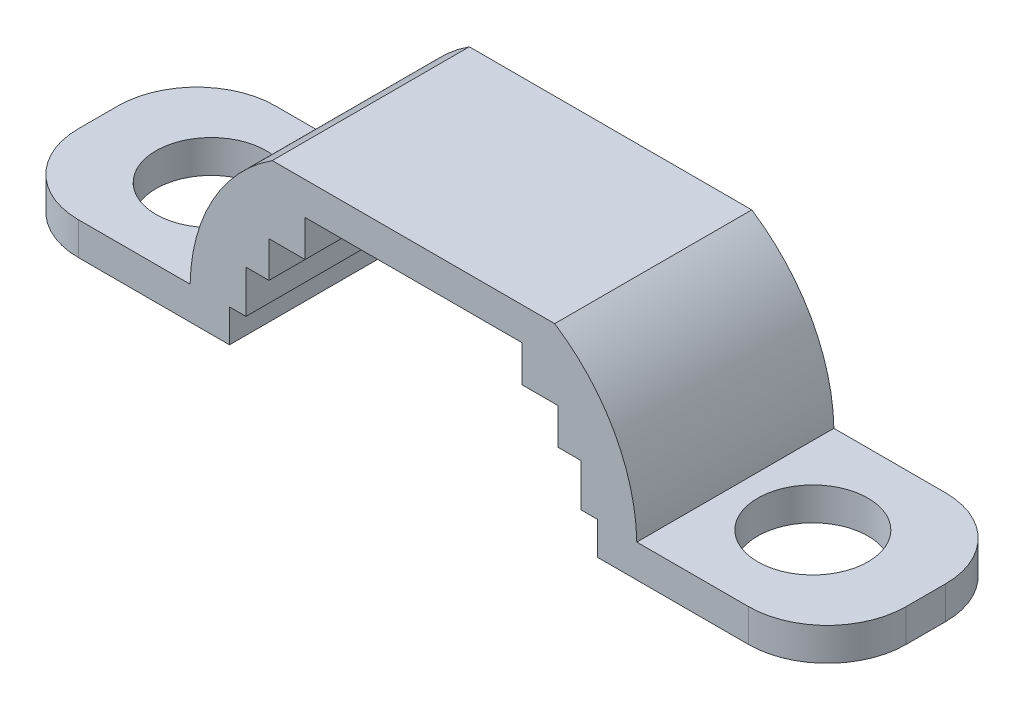
ISO-10303-21;
HEADER;
FILE_DESCRIPTION(('STEP AP214'),'2;1');
FILE_NAME('part.step','',(''),(''),'','','');
FILE_SCHEMA(('AUTOMOTIVE_DESIGN { 1 0 10303 214 1 1 1 1 }'));
ENDSEC;
DATA;
#1=APPLICATION_CONTEXT('core data for automotive mechanical design processes');
#2=APPLICATION_PROTOCOL_DEFINITION('international standard','automotive_design',2000,#1);
#3=PRODUCT_CONTEXT('',#1,'mechanical');
#4=PRODUCT('Part','Part','',(#3));
#5=PRODUCT_RELATED_PRODUCT_CATEGORY('part','',(#4));
#6=PRODUCT_DEFINITION_FORMATION('','',#4);
#7=PRODUCT_DEFINITION_CONTEXT('part definition',#1,'design');
#8=PRODUCT_DEFINITION('design','',#6,#7);
#9=PRODUCT_DEFINITION_SHAPE('','',#8);
#10=(LENGTH_UNIT() NAMED_UNIT(*) SI_UNIT(.MILLI.,.METRE.));
#11=(NAMED_UNIT(*) PLANE_ANGLE_UNIT() SI_UNIT($,.RADIAN.));
#12=(NAMED_UNIT(*) SI_UNIT($,.STERADIAN.) SOLID_ANGLE_UNIT());
#13=UNCERTAINTY_MEASURE_WITH_UNIT(LENGTH_MEASURE(1.E-05),#10,'distance_accuracy_value','');
#14=(GEOMETRIC_REPRESENTATION_CONTEXT(3) GLOBAL_UNCERTAINTY_ASSIGNED_CONTEXT((#13)) GLOBAL_UNIT_ASSIGNED_CONTEXT((#10,
#11,#12)) REPRESENTATION_CONTEXT('',''));
#15=CARTESIAN_POINT('',(0.,0.,0.));
#16=DIRECTION('',(0.,0.,1.));
#17=DIRECTION('',(1.,0.,0.));
#18=AXIS2_PLACEMENT_3D('',#15,#16,#17);
#19=CARTESIAN_POINT('',(-63.,9.5,15.));
#20=DIRECTION('',(0.,1.,0.));
#21=DIRECTION('',(0.,0.,1.));
#22=AXIS2_PLACEMENT_3D('',#19,#20,#21);
#23=PLANE('',#22);
#24=CARTESIAN_POINT('',(-45.8,9.5,0.));
#25=DIRECTION('',(0.,1.,0.));
#26=DIRECTION('',(0.,0.,1.));
#27=AXIS2_PLACEMENT_3D('',#24,#25,#26);
#28=CIRCLE('',#27,8.4);
#29=CARTESIAN_POINT('',(-45.8,9.5,8.4));
#30=VERTEX_POINT('',#29);
#31=EDGE_CURVE('E436',#30,#30,#28,.T.);
#32=ORIENTED_EDGE('',*,*,#31,.F.);
#33=EDGE_LOOP('',(#32));
#34=FACE_BOUND('',#33,.T.);
#35=DIRECTION('',(1.,0.,0.));
#36=VECTOR('',#35,1.);
#37=CARTESIAN_POINT('',(-63.,9.5,15.));
#38=LINE('',#37,#36);
#39=CARTESIAN_POINT('',(-51.,9.5,15.));
#40=VERTEX_POINT('',#39);
#41=CARTESIAN_POINT('',(-34.,9.50000000000001,15.));
#42=VERTEX_POINT('',#41);
#43=EDGE_CURVE('E448',#40,#42,#38,.T.);
#44=ORIENTED_EDGE('',*,*,#43,.T.);
#45=DIRECTION('',(0.,0.,-1.));
#46=VECTOR('',#45,1.);
#47=CARTESIAN_POINT('',(-34.,9.50000000000001,40.7827946506968));
#48=LINE('',#47,#46);
#49=CARTESIAN_POINT('',(-34.,9.50000000000001,-15.));
#50=VERTEX_POINT('',#49);
#51=EDGE_CURVE('E251',#42,#50,#48,.T.);
#52=ORIENTED_EDGE('',*,*,#51,.T.);
#53=DIRECTION('',(1.,0.,0.));
#54=VECTOR('',#53,1.);
#55=CARTESIAN_POINT('',(-63.,9.5,-15.));
#56=LINE('',#55,#54);
#57=CARTESIAN_POINT('',(-51.,9.5,-15.));
#58=VERTEX_POINT('',#57);
#59=EDGE_CURVE('E249',#58,#50,#56,.T.);
#60=ORIENTED_EDGE('',*,*,#59,.F.);
#61=CARTESIAN_POINT('',(-51.,9.5,-3.));
#62=DIRECTION('',(0.,1.,0.));
#63=DIRECTION('',(0.,0.,1.));
#64=AXIS2_PLACEMENT_3D('',#61,#62,#63);
#65=CIRCLE('',#64,12.);
#66=CARTESIAN_POINT('',(-63.,9.5,-3.));
#67=VERTEX_POINT('',#66);
#68=EDGE_CURVE('E335',#58,#67,#65,.T.);
#69=ORIENTED_EDGE('',*,*,#68,.T.);
#70=DIRECTION('',(0.,0.,-1.));
#71=VECTOR('',#70,1.);
#72=CARTESIAN_POINT('',(-63.,9.5,15.));
#73=LINE('',#72,#71);
#74=CARTESIAN_POINT('',(-63.,9.5,3.));
#75=VERTEX_POINT('',#74);
#76=EDGE_CURVE('E239',#75,#67,#73,.T.);
#77=ORIENTED_EDGE('',*,*,#76,.F.);
#78=CARTESIAN_POINT('',(-51.,9.5,3.));
#79=DIRECTION('',(0.,1.,0.));
#80=DIRECTION('',(0.,0.,1.));
#81=AXIS2_PLACEMENT_3D('',#78,#79,#80);
#82=CIRCLE('',#81,12.);
#83=EDGE_CURVE('E332',#75,#40,#82,.T.);
#84=ORIENTED_EDGE('',*,*,#83,.T.);
#85=EDGE_LOOP('',(#44,#52,#60,#69,#77,#84));
#86=FACE_BOUND('',#85,.T.);
#87=ADVANCED_FACE('F39',(#34,#86),#23,.T.);
#88=CARTESIAN_POINT('',(-16.5,27.05,15.));
#89=DIRECTION('',(0.,1.,0.));
#90=DIRECTION('',(0.,0.,1.));
#91=AXIS2_PLACEMENT_3D('',#88,#89,#90);
#92=PLANE('',#91);
#93=DIRECTION('',(1.,0.,0.));
#94=VECTOR('',#93,1.);
#95=CARTESIAN_POINT('',(-16.5,27.05,-15.));
#96=LINE('',#95,#94);
#97=CARTESIAN_POINT('',(-16.5,27.05,-15.));
#98=VERTEX_POINT('',#97);
#99=CARTESIAN_POINT('',(16.5,27.05,-15.));
#100=VERTEX_POINT('',#99);
#101=EDGE_CURVE('E256',#98,#100,#96,.T.);
#102=ORIENTED_EDGE('',*,*,#101,.T.);
#103=DIRECTION('',(0.,0.,-1.));
#104=VECTOR('',#103,1.);
#105=CARTESIAN_POINT('',(16.5,27.05,15.));
#106=LINE('',#105,#104);
#107=CARTESIAN_POINT('',(16.5,27.05,15.));
#108=VERTEX_POINT('',#107);
#109=EDGE_CURVE('E432',#108,#100,#106,.T.);
#110=ORIENTED_EDGE('',*,*,#109,.F.);
#111=DIRECTION('',(1.,0.,0.));
#112=VECTOR('',#111,1.);
#113=CARTESIAN_POINT('',(-16.5,27.05,15.));
#114=LINE('',#113,#112);
#115=CARTESIAN_POINT('',(-16.5,27.05,15.));
#116=VERTEX_POINT('',#115);
#117=EDGE_CURVE('E289',#116,#108,#114,.T.);
#118=ORIENTED_EDGE('',*,*,#117,.F.);
#119=DIRECTION('',(0.,0.,-1.));
#120=VECTOR('',#119,1.);
#121=CARTESIAN_POINT('',(-16.5,27.05,15.));
#122=LINE('',#121,#120);
#123=EDGE_CURVE('E290',#116,#98,#122,.T.);
#124=ORIENTED_EDGE('',*,*,#123,.T.);
#125=EDGE_LOOP('',(#102,#110,#118,#124));
#126=FACE_BOUND('',#125,.T.);
#127=ADVANCED_FACE('F487',(#126),#92,.F.);
#128=CARTESIAN_POINT('',(-16.5,32.05,15.));
#129=DIRECTION('',(0.,1.,0.));
#130=DIRECTION('',(0.,0.,1.));
#131=AXIS2_PLACEMENT_3D('',#128,#129,#130);
#132=PLANE('',#131);
#133=DIRECTION('',(1.,0.,0.));
#134=VECTOR('',#133,1.);
#135=CARTESIAN_POINT('',(-16.5,32.05,-15.));
#136=LINE('',#135,#134);
#137=CARTESIAN_POINT('',(-21.5,32.05,-15.));
#138=VERTEX_POINT('',#137);
#139=CARTESIAN_POINT('',(21.5,32.05,-15.));
#140=VERTEX_POINT('',#139);
#141=EDGE_CURVE('E245',#138,#140,#136,.T.);
#142=ORIENTED_EDGE('',*,*,#141,.F.);
#143=DIRECTION('',(0.,0.,-1.));
#144=VECTOR('',#143,1.);
#145=CARTESIAN_POINT('',(-21.5,32.05,15.));
#146=LINE('',#145,#144);
#147=CARTESIAN_POINT('',(-21.5,32.05,15.));
#148=VERTEX_POINT('',#147);
#149=EDGE_CURVE('E226',#148,#138,#146,.T.);
#150=ORIENTED_EDGE('',*,*,#149,.F.);
#151=DIRECTION('',(1.,0.,0.));
#152=VECTOR('',#151,1.);
#153=CARTESIAN_POINT('',(-16.5,32.05,15.));
#154=LINE('',#153,#152);
#155=CARTESIAN_POINT('',(21.5,32.05,15.));
#156=VERTEX_POINT('',#155);
#157=EDGE_CURVE('E445',#148,#156,#154,.T.);
#158=ORIENTED_EDGE('',*,*,#157,.T.);
#159=DIRECTION('',(0.,0.,-1.));
#160=VECTOR('',#159,1.);
#161=CARTESIAN_POINT('',(21.5,32.05,15.));
#162=LINE('',#161,#160);
#163=EDGE_CURVE('E254',#156,#140,#162,.T.);
#164=ORIENTED_EDGE('',*,*,#163,.T.);
#165=EDGE_LOOP('',(#142,#150,#158,#164));
#166=FACE_BOUND('',#165,.T.);
#167=ADVANCED_FACE('F253',(#166),#132,.T.);
#168=CARTESIAN_POINT('',(-63.,4.5,15.));
#169=DIRECTION('',(-1.,0.,0.));
#170=DIRECTION('',(0.,0.,1.));
#171=AXIS2_PLACEMENT_3D('',#168,#169,#170);
#172=PLANE('',#171);
#173=ORIENTED_EDGE('',*,*,#76,.T.);
#174=DIRECTION('',(0.,1.,0.));
#175=VECTOR('',#174,1.);
#176=CARTESIAN_POINT('',(-63.,4.5,-3.));
#177=LINE('',#176,#175);
#178=CARTESIAN_POINT('',(-63.,4.5,-3.));
#179=VERTEX_POINT('',#178);
#180=EDGE_CURVE('E342',#67,#179,#177,.F.);
#181=ORIENTED_EDGE('',*,*,#180,.T.);
#182=DIRECTION('',(0.,0.,-1.));
#183=VECTOR('',#182,1.);
#184=CARTESIAN_POINT('',(-63.,4.5,15.));
#185=LINE('',#184,#183);
#186=CARTESIAN_POINT('',(-63.,4.5,3.));
#187=VERTEX_POINT('',#186);
#188=EDGE_CURVE('E323',#187,#179,#185,.T.);
#189=ORIENTED_EDGE('',*,*,#188,.F.);
#190=DIRECTION('',(0.,1.,0.));
#191=VECTOR('',#190,1.);
#192=CARTESIAN_POINT('',(-63.,9.5,3.));
#193=LINE('',#192,#191);
#194=EDGE_CURVE('E338',#187,#75,#193,.T.);
#195=ORIENTED_EDGE('',*,*,#194,.T.);
#196=EDGE_LOOP('',(#173,#181,#189,#195));
#197=FACE_BOUND('',#196,.T.);
#198=ADVANCED_FACE('F612',(#197),#172,.T.);
#199=CARTESIAN_POINT('',(-63.,4.5,15.));
#200=DIRECTION('',(0.,1.,0.));
#201=DIRECTION('',(0.,0.,1.));
#202=AXIS2_PLACEMENT_3D('',#199,#200,#201);
#203=PLANE('',#202);
#204=CARTESIAN_POINT('',(-45.8,4.5,0.));
#205=DIRECTION('',(0.,1.,0.));
#206=DIRECTION('',(0.,0.,1.));
#207=AXIS2_PLACEMENT_3D('',#204,#205,#206);
#208=CIRCLE('',#207,8.4);
#209=CARTESIAN_POINT('',(-45.8,4.5,8.4));
#210=VERTEX_POINT('',#209);
#211=EDGE_CURVE('E262',#210,#210,#208,.T.);
#212=ORIENTED_EDGE('',*,*,#211,.T.);
#213=EDGE_LOOP('',(#212));
#214=FACE_BOUND('',#213,.T.);
#215=ORIENTED_EDGE('',*,*,#188,.T.);
#216=CARTESIAN_POINT('',(-51.,4.5,-3.));
#217=DIRECTION('',(0.,1.,0.));
#218=DIRECTION('',(0.,0.,1.));
#219=AXIS2_PLACEMENT_3D('',#216,#217,#218);
#220=CIRCLE('',#219,12.);
#221=CARTESIAN_POINT('',(-51.,4.5,-15.));
#222=VERTEX_POINT('',#221);
#223=EDGE_CURVE('E348',#179,#222,#220,.F.);
#224=ORIENTED_EDGE('',*,*,#223,.T.);
#225=DIRECTION('',(1.,0.,0.));
#226=VECTOR('',#225,1.);
#227=CARTESIAN_POINT('',(-63.,4.5,-15.));
#228=LINE('',#227,#226);
#229=CARTESIAN_POINT('',(-28.,4.5,-15.));
#230=VERTEX_POINT('',#229);
#231=EDGE_CURVE('E260',#222,#230,#228,.T.);
#232=ORIENTED_EDGE('',*,*,#231,.T.);
#233=DIRECTION('',(0.,0.,-1.));
#234=VECTOR('',#233,1.);
#235=CARTESIAN_POINT('',(-28.,4.5,15.));
#236=LINE('',#235,#234);
#237=CARTESIAN_POINT('',(-28.,4.5,15.));
#238=VERTEX_POINT('',#237);
#239=EDGE_CURVE('E319',#238,#230,#236,.T.);
#240=ORIENTED_EDGE('',*,*,#239,.F.);
#241=DIRECTION('',(1.,0.,0.));
#242=VECTOR('',#241,1.);
#243=CARTESIAN_POINT('',(-63.,4.5,15.));
#244=LINE('',#243,#242);
#245=CARTESIAN_POINT('',(-51.,4.5,15.));
#246=VERTEX_POINT('',#245);
#247=EDGE_CURVE('E452',#246,#238,#244,.T.);
#248=ORIENTED_EDGE('',*,*,#247,.F.);
#249=CARTESIAN_POINT('',(-51.,4.5,3.));
#250=DIRECTION('',(0.,1.,0.));
#251=DIRECTION('',(0.,0.,1.));
#252=AXIS2_PLACEMENT_3D('',#249,#250,#251);
#253=CIRCLE('',#252,12.);
#254=EDGE_CURVE('E345',#246,#187,#253,.F.);
#255=ORIENTED_EDGE('',*,*,#254,.T.);
#256=EDGE_LOOP('',(#215,#224,#232,#240,#248,#255));
#257=FACE_BOUND('',#256,.T.);
#258=ADVANCED_FACE('F700',(#214,#257),#203,.F.);
#259=CARTESIAN_POINT('',(-28.,4.5,15.));
#260=DIRECTION('',(-1.,0.,0.));
#261=DIRECTION('',(0.,0.,1.));
#262=AXIS2_PLACEMENT_3D('',#259,#260,#261);
#263=PLANE('',#262);
#264=DIRECTION('',(0.,1.,0.));
#265=VECTOR('',#264,1.);
#266=CARTESIAN_POINT('',(-28.,4.5,-15.));
#267=LINE('',#266,#265);
#268=CARTESIAN_POINT('',(-28.,9.5,-15.));
#269=VERTEX_POINT('',#268);
#270=EDGE_CURVE('E268',#230,#269,#267,.T.);
#271=ORIENTED_EDGE('',*,*,#270,.T.);
#272=DIRECTION('',(0.,0.,-1.));
#273=VECTOR('',#272,1.);
#274=CARTESIAN_POINT('',(-28.,9.5,15.));
#275=LINE('',#274,#273);
#276=CARTESIAN_POINT('',(-28.,9.5,15.));
#277=VERTEX_POINT('',#276);
#278=EDGE_CURVE('E315',#277,#269,#275,.T.);
#279=ORIENTED_EDGE('',*,*,#278,.F.);
#280=DIRECTION('',(0.,1.,0.));
#281=VECTOR('',#280,1.);
#282=CARTESIAN_POINT('',(-28.,4.5,15.));
#283=LINE('',#282,#281);
#284=EDGE_CURVE('E455',#238,#277,#283,.T.);
#285=ORIENTED_EDGE('',*,*,#284,.F.);
#286=ORIENTED_EDGE('',*,*,#239,.T.);
#287=EDGE_LOOP('',(#271,#279,#285,#286));
#288=FACE_BOUND('',#287,.T.);
#289=ADVANCED_FACE('F600',(#288),#263,.F.);
#290=CARTESIAN_POINT('',(-28.,9.5,15.));
#291=DIRECTION('',(0.,1.,0.));
#292=DIRECTION('',(0.,0.,1.));
#293=AXIS2_PLACEMENT_3D('',#290,#291,#292);
#294=PLANE('',#293);
#295=DIRECTION('',(1.,0.,0.));
#296=VECTOR('',#295,1.);
#297=CARTESIAN_POINT('',(-28.,9.5,-15.));
#298=LINE('',#297,#296);
#299=CARTESIAN_POINT('',(-25.5,9.5,-15.));
#300=VERTEX_POINT('',#299);
#301=EDGE_CURVE('E271',#269,#300,#298,.T.);
#302=ORIENTED_EDGE('',*,*,#301,.T.);
#303=DIRECTION('',(0.,0.,-1.));
#304=VECTOR('',#303,1.);
#305=CARTESIAN_POINT('',(-25.5,9.5,15.));
#306=LINE('',#305,#304);
#307=CARTESIAN_POINT('',(-25.5,9.5,15.));
#308=VERTEX_POINT('',#307);
#309=EDGE_CURVE('E311',#308,#300,#306,.T.);
#310=ORIENTED_EDGE('',*,*,#309,.F.);
#311=DIRECTION('',(1.,0.,0.));
#312=VECTOR('',#311,1.);
#313=CARTESIAN_POINT('',(-28.,9.5,15.));
#314=LINE('',#313,#312);
#315=EDGE_CURVE('E458',#277,#308,#314,.T.);
#316=ORIENTED_EDGE('',*,*,#315,.F.);
#317=ORIENTED_EDGE('',*,*,#278,.T.);
#318=EDGE_LOOP('',(#302,#310,#316,#317));
#319=FACE_BOUND('',#318,.T.);
#320=ADVANCED_FACE('F596',(#319),#294,.F.);
#321=CARTESIAN_POINT('',(-25.5,9.5,15.));
#322=DIRECTION('',(-1.,0.,0.));
#323=DIRECTION('',(0.,0.,1.));
#324=AXIS2_PLACEMENT_3D('',#321,#322,#323);
#325=PLANE('',#324);
#326=DIRECTION('',(0.,1.,0.));
#327=VECTOR('',#326,1.);
#328=CARTESIAN_POINT('',(-25.5,9.5,-15.));
#329=LINE('',#328,#327);
#330=CARTESIAN_POINT('',(-25.5,16.,-15.));
#331=VERTEX_POINT('',#330);
#332=EDGE_CURVE('E274',#300,#331,#329,.T.);
#333=ORIENTED_EDGE('',*,*,#332,.T.);
#334=DIRECTION('',(0.,0.,-1.));
#335=VECTOR('',#334,1.);
#336=CARTESIAN_POINT('',(-25.5,16.,15.));
#337=LINE('',#336,#335);
#338=CARTESIAN_POINT('',(-25.5,16.,15.));
#339=VERTEX_POINT('',#338);
#340=EDGE_CURVE('E307',#339,#331,#337,.T.);
#341=ORIENTED_EDGE('',*,*,#340,.F.);
#342=DIRECTION('',(0.,1.,0.));
#343=VECTOR('',#342,1.);
#344=CARTESIAN_POINT('',(-25.5,9.5,15.));
#345=LINE('',#344,#343);
#346=EDGE_CURVE('E461',#308,#339,#345,.T.);
#347=ORIENTED_EDGE('',*,*,#346,.F.);
#348=ORIENTED_EDGE('',*,*,#309,.T.);
#349=EDGE_LOOP('',(#333,#341,#347,#348));
#350=FACE_BOUND('',#349,.T.);
#351=ADVANCED_FACE('F591',(#350),#325,.F.);
#352=CARTESIAN_POINT('',(-25.5,16.,15.));
#353=DIRECTION('',(0.,1.,0.));
#354=DIRECTION('',(0.,0.,1.));
#355=AXIS2_PLACEMENT_3D('',#352,#353,#354);
#356=PLANE('',#355);
#357=DIRECTION('',(1.,0.,0.));
#358=VECTOR('',#357,1.);
#359=CARTESIAN_POINT('',(-25.5,16.,-15.));
#360=LINE('',#359,#358);
#361=CARTESIAN_POINT('',(-22.,16.,-15.));
#362=VERTEX_POINT('',#361);
#363=EDGE_CURVE('E277',#331,#362,#360,.T.);
#364=ORIENTED_EDGE('',*,*,#363,.T.);
#365=DIRECTION('',(0.,0.,-1.));
#366=VECTOR('',#365,1.);
#367=CARTESIAN_POINT('',(-22.,16.,15.));
#368=LINE('',#367,#366);
#369=CARTESIAN_POINT('',(-22.,16.,15.));
#370=VERTEX_POINT('',#369);
#371=EDGE_CURVE('E303',#370,#362,#368,.T.);
#372=ORIENTED_EDGE('',*,*,#371,.F.);
#373=DIRECTION('',(1.,0.,0.));
#374=VECTOR('',#373,1.);
#375=CARTESIAN_POINT('',(-25.5,16.,15.));
#376=LINE('',#375,#374);
#377=EDGE_CURVE('E464',#339,#370,#376,.T.);
#378=ORIENTED_EDGE('',*,*,#377,.F.);
#379=ORIENTED_EDGE('',*,*,#340,.T.);
#380=EDGE_LOOP('',(#364,#372,#378,#379));
#381=FACE_BOUND('',#380,.T.);
#382=ADVANCED_FACE('F585',(#381),#356,.F.);
#383=CARTESIAN_POINT('',(-22.,16.,15.));
#384=DIRECTION('',(-1.,0.,0.));
#385=DIRECTION('',(0.,0.,1.));
#386=AXIS2_PLACEMENT_3D('',#383,#384,#385);
#387=PLANE('',#386);
#388=DIRECTION('',(0.,1.,0.));
#389=VECTOR('',#388,1.);
#390=CARTESIAN_POINT('',(-22.,16.,-15.));
#391=LINE('',#390,#389);
#392=CARTESIAN_POINT('',(-22.,21.5,-15.));
#393=VERTEX_POINT('',#392);
#394=EDGE_CURVE('E280',#362,#393,#391,.T.);
#395=ORIENTED_EDGE('',*,*,#394,.T.);
#396=DIRECTION('',(0.,0.,-1.));
#397=VECTOR('',#396,1.);
#398=CARTESIAN_POINT('',(-22.,21.5,15.));
#399=LINE('',#398,#397);
#400=CARTESIAN_POINT('',(-22.,21.5,15.));
#401=VERTEX_POINT('',#400);
#402=EDGE_CURVE('E299',#401,#393,#399,.T.);
#403=ORIENTED_EDGE('',*,*,#402,.F.);
#404=DIRECTION('',(0.,1.,0.));
#405=VECTOR('',#404,1.);
#406=CARTESIAN_POINT('',(-22.,16.,15.));
#407=LINE('',#406,#405);
#408=EDGE_CURVE('E467',#370,#401,#407,.T.);
#409=ORIENTED_EDGE('',*,*,#408,.F.);
#410=ORIENTED_EDGE('',*,*,#371,.T.);
#411=EDGE_LOOP('',(#395,#403,#409,#410));
#412=FACE_BOUND('',#411,.T.);
#413=ADVANCED_FACE('F581',(#412),#387,.F.);
#414=CARTESIAN_POINT('',(-22.,21.5,15.));
#415=DIRECTION('',(0.,1.,0.));
#416=DIRECTION('',(0.,0.,1.));
#417=AXIS2_PLACEMENT_3D('',#414,#415,#416);
#418=PLANE('',#417);
#419=DIRECTION('',(1.,0.,0.));
#420=VECTOR('',#419,1.);
#421=CARTESIAN_POINT('',(-22.,21.5,-15.));
#422=LINE('',#421,#420);
#423=CARTESIAN_POINT('',(-16.5,21.5,-15.));
#424=VERTEX_POINT('',#423);
#425=EDGE_CURVE('E283',#393,#424,#422,.T.);
#426=ORIENTED_EDGE('',*,*,#425,.T.);
#427=DIRECTION('',(0.,0.,-1.));
#428=VECTOR('',#427,1.);
#429=CARTESIAN_POINT('',(-16.5,21.5,15.));
#430=LINE('',#429,#428);
#431=CARTESIAN_POINT('',(-16.5,21.5,15.));
#432=VERTEX_POINT('',#431);
#433=EDGE_CURVE('E294',#432,#424,#430,.T.);
#434=ORIENTED_EDGE('',*,*,#433,.F.);
#435=DIRECTION('',(1.,0.,0.));
#436=VECTOR('',#435,1.);
#437=CARTESIAN_POINT('',(-22.,21.5,15.));
#438=LINE('',#437,#436);
#439=EDGE_CURVE('E470',#401,#432,#438,.T.);
#440=ORIENTED_EDGE('',*,*,#439,.F.);
#441=ORIENTED_EDGE('',*,*,#402,.T.);
#442=EDGE_LOOP('',(#426,#434,#440,#441));
#443=FACE_BOUND('',#442,.T.);
#444=ADVANCED_FACE('F577',(#443),#418,.F.);
#445=CARTESIAN_POINT('',(-16.5,21.5,15.));
#446=DIRECTION('',(-1.,0.,0.));
#447=DIRECTION('',(0.,0.,1.));
#448=AXIS2_PLACEMENT_3D('',#445,#446,#447);
#449=PLANE('',#448);
#450=DIRECTION('',(0.,1.,0.));
#451=VECTOR('',#450,1.);
#452=CARTESIAN_POINT('',(-16.5,21.5,-15.));
#453=LINE('',#452,#451);
#454=EDGE_CURVE('E286',#424,#98,#453,.T.);
#455=ORIENTED_EDGE('',*,*,#454,.T.);
#456=ORIENTED_EDGE('',*,*,#123,.F.);
#457=DIRECTION('',(0.,1.,0.));
#458=VECTOR('',#457,1.);
#459=CARTESIAN_POINT('',(-16.5,21.5,15.));
#460=LINE('',#459,#458);
#461=EDGE_CURVE('E295',#432,#116,#460,.T.);
#462=ORIENTED_EDGE('',*,*,#461,.F.);
#463=ORIENTED_EDGE('',*,*,#433,.T.);
#464=EDGE_LOOP('',(#455,#456,#462,#463));
#465=FACE_BOUND('',#464,.T.);
#466=ADVANCED_FACE('F483',(#465),#449,.F.);
#467=CARTESIAN_POINT('',(0.,0.,15.));
#468=DIRECTION('',(0.,0.,-1.));
#469=DIRECTION('',(-1.,0.,0.));
#470=AXIS2_PLACEMENT_3D('',#467,#468,#469);
#471=PLANE('',#470);
#472=ORIENTED_EDGE('',*,*,#157,.F.);
#473=CARTESIAN_POINT('',(-6.50457936482984,8.99815929314292,15.));
#474=DIRECTION('',(0.,0.,-1.));
#475=DIRECTION('',(-1.,0.,0.));
#476=AXIS2_PLACEMENT_3D('',#473,#474,#475);
#477=CIRCLE('',#476,27.5);
#478=EDGE_CURVE('E232',#42,#148,#477,.T.);
#479=ORIENTED_EDGE('',*,*,#478,.F.);
#480=ORIENTED_EDGE('',*,*,#43,.F.);
#481=DIRECTION('',(0.,1.,0.));
#482=VECTOR('',#481,1.);
#483=CARTESIAN_POINT('',(-51.,4.5,15.));
#484=LINE('',#483,#482);
#485=EDGE_CURVE('E351',#40,#246,#484,.F.);
#486=ORIENTED_EDGE('',*,*,#485,.T.);
#487=ORIENTED_EDGE('',*,*,#247,.T.);
#488=ORIENTED_EDGE('',*,*,#284,.T.);
#489=ORIENTED_EDGE('',*,*,#315,.T.);
#490=ORIENTED_EDGE('',*,*,#346,.T.);
#491=ORIENTED_EDGE('',*,*,#377,.T.);
#492=ORIENTED_EDGE('',*,*,#408,.T.);
#493=ORIENTED_EDGE('',*,*,#439,.T.);
#494=ORIENTED_EDGE('',*,*,#461,.T.);
#495=ORIENTED_EDGE('',*,*,#117,.T.);
#496=DIRECTION('',(0.,1.,0.));
#497=VECTOR('',#496,1.);
#498=CARTESIAN_POINT('',(16.5,21.5,15.));
#499=LINE('',#498,#497);
#500=CARTESIAN_POINT('',(16.5,21.5,15.));
#501=VERTEX_POINT('',#500);
#502=EDGE_CURVE('E396',#501,#108,#499,.T.);
#503=ORIENTED_EDGE('',*,*,#502,.F.);
#504=DIRECTION('',(-1.,0.,0.));
#505=VECTOR('',#504,1.);
#506=CARTESIAN_POINT('',(22.,21.5,15.));
#507=LINE('',#506,#505);
#508=CARTESIAN_POINT('',(22.,21.5,15.));
#509=VERTEX_POINT('',#508);
#510=EDGE_CURVE('E401',#509,#501,#507,.T.);
#511=ORIENTED_EDGE('',*,*,#510,.F.);
#512=DIRECTION('',(0.,1.,0.));
#513=VECTOR('',#512,1.);
#514=CARTESIAN_POINT('',(22.,16.,15.));
#515=LINE('',#514,#513);
#516=CARTESIAN_POINT('',(22.,16.,15.));
#517=VERTEX_POINT('',#516);
#518=EDGE_CURVE('E500',#517,#509,#515,.T.);
#519=ORIENTED_EDGE('',*,*,#518,.F.);
#520=DIRECTION('',(-1.,0.,0.));
#521=VECTOR('',#520,1.);
#522=CARTESIAN_POINT('',(25.5,16.,15.));
#523=LINE('',#522,#521);
#524=CARTESIAN_POINT('',(25.5,16.,15.));
#525=VERTEX_POINT('',#524);
#526=EDGE_CURVE('E503',#525,#517,#523,.T.);
#527=ORIENTED_EDGE('',*,*,#526,.F.);
#528=DIRECTION('',(0.,1.,0.));
#529=VECTOR('',#528,1.);
#530=CARTESIAN_POINT('',(25.5,9.5,15.));
#531=LINE('',#530,#529);
#532=CARTESIAN_POINT('',(25.5,9.5,15.));
#533=VERTEX_POINT('',#532);
#534=EDGE_CURVE('E510',#533,#525,#531,.T.);
#535=ORIENTED_EDGE('',*,*,#534,.F.);
#536=DIRECTION('',(-1.,0.,0.));
#537=VECTOR('',#536,1.);
#538=CARTESIAN_POINT('',(28.,9.5,15.));
#539=LINE('',#538,#537);
#540=CARTESIAN_POINT('',(28.,9.5,15.));
#541=VERTEX_POINT('',#540);
#542=EDGE_CURVE('E514',#541,#533,#539,.T.);
#543=ORIENTED_EDGE('',*,*,#542,.F.);
#544=DIRECTION('',(0.,1.,0.));
#545=VECTOR('',#544,1.);
#546=CARTESIAN_POINT('',(28.,4.5,15.));
#547=LINE('',#546,#545);
#548=CARTESIAN_POINT('',(28.,4.5,15.));
#549=VERTEX_POINT('',#548);
#550=EDGE_CURVE('E518',#549,#541,#547,.T.);
#551=ORIENTED_EDGE('',*,*,#550,.F.);
#552=DIRECTION('',(-1.,0.,0.));
#553=VECTOR('',#552,1.);
#554=CARTESIAN_POINT('',(63.,4.5,15.));
#555=LINE('',#554,#553);
#556=CARTESIAN_POINT('',(51.,4.5,15.));
#557=VERTEX_POINT('',#556);
#558=EDGE_CURVE('E522',#557,#549,#555,.T.);
#559=ORIENTED_EDGE('',*,*,#558,.F.);
#560=DIRECTION('',(0.,1.,0.));
#561=VECTOR('',#560,1.);
#562=CARTESIAN_POINT('',(51.,0.,15.));
#563=LINE('',#562,#561);
#564=CARTESIAN_POINT('',(51.,9.5,15.));
#565=VERTEX_POINT('',#564);
#566=EDGE_CURVE('E11',#557,#565,#563,.T.);
#567=ORIENTED_EDGE('',*,*,#566,.T.);
#568=DIRECTION('',(-1.,0.,0.));
#569=VECTOR('',#568,1.);
#570=CARTESIAN_POINT('',(63.,9.5,15.));
#571=LINE('',#570,#569);
#572=CARTESIAN_POINT('',(34.,9.50000000000001,15.));
#573=VERTEX_POINT('',#572);
#574=EDGE_CURVE('E409',#565,#573,#571,.T.);
#575=ORIENTED_EDGE('',*,*,#574,.T.);
#576=CARTESIAN_POINT('',(6.50457936482984,8.99815929314292,15.));
#577=DIRECTION('',(0.,0.,-1.));
#578=DIRECTION('',(-1.,0.,0.));
#579=AXIS2_PLACEMENT_3D('',#576,#577,#578);
#580=CIRCLE('',#579,27.5);
#581=EDGE_CURVE('E627',#573,#156,#580,.F.);
#582=ORIENTED_EDGE('',*,*,#581,.T.);
#583=EDGE_LOOP('',(#472,#479,#480,#486,#487,#488,#489,#490,#491,#492,#493,#494,#495,#503,#511,
#519,#527,#535,#543,#551,#559,#567,#575,#582));
#584=FACE_BOUND('',#583,.T.);
#585=ADVANCED_FACE('F476',(#584),#471,.F.);
#586=CARTESIAN_POINT('',(0.,0.,-15.));
#587=DIRECTION('',(0.,0.,-1.));
#588=DIRECTION('',(-1.,0.,0.));
#589=AXIS2_PLACEMENT_3D('',#586,#587,#588);
#590=PLANE('',#589);
#591=CARTESIAN_POINT('',(-6.50457936482984,8.99815929314292,-15.));
#592=DIRECTION('',(0.,0.,1.));
#593=DIRECTION('',(-1.,0.,0.));
#594=AXIS2_PLACEMENT_3D('',#591,#592,#593);
#595=CIRCLE('',#594,27.5);
#596=EDGE_CURVE('E230',#138,#50,#595,.T.);
#597=ORIENTED_EDGE('',*,*,#596,.F.);
#598=ORIENTED_EDGE('',*,*,#141,.T.);
#599=CARTESIAN_POINT('',(6.50457936482984,8.99815929314292,-15.));
#600=DIRECTION('',(0.,0.,-1.));
#601=DIRECTION('',(1.,0.,0.));
#602=AXIS2_PLACEMENT_3D('',#599,#600,#601);
#603=CIRCLE('',#602,27.5);
#604=CARTESIAN_POINT('',(34.,9.50000000000001,-15.));
#605=VERTEX_POINT('',#604);
#606=EDGE_CURVE('E394',#140,#605,#603,.T.);
#607=ORIENTED_EDGE('',*,*,#606,.T.);
#608=DIRECTION('',(-1.,0.,0.));
#609=VECTOR('',#608,1.);
#610=CARTESIAN_POINT('',(63.,9.5,-15.));
#611=LINE('',#610,#609);
#612=CARTESIAN_POINT('',(51.,9.5,-15.));
#613=VERTEX_POINT('',#612);
#614=EDGE_CURVE('E393',#613,#605,#611,.T.);
#615=ORIENTED_EDGE('',*,*,#614,.F.);
#616=DIRECTION('',(0.,1.,0.));
#617=VECTOR('',#616,1.);
#618=CARTESIAN_POINT('',(51.,4.5,-15.));
#619=LINE('',#618,#617);
#620=CARTESIAN_POINT('',(51.,4.5,-15.));
#621=VERTEX_POINT('',#620);
#622=EDGE_CURVE('E63',#613,#621,#619,.F.);
#623=ORIENTED_EDGE('',*,*,#622,.T.);
#624=DIRECTION('',(-1.,0.,0.));
#625=VECTOR('',#624,1.);
#626=CARTESIAN_POINT('',(63.,4.5,-15.));
#627=LINE('',#626,#625);
#628=CARTESIAN_POINT('',(28.,4.5,-15.));
#629=VERTEX_POINT('',#628);
#630=EDGE_CURVE('E376',#621,#629,#627,.T.);
#631=ORIENTED_EDGE('',*,*,#630,.T.);
#632=DIRECTION('',(0.,1.,0.));
#633=VECTOR('',#632,1.);
#634=CARTESIAN_POINT('',(28.,4.5,-15.));
#635=LINE('',#634,#633);
#636=CARTESIAN_POINT('',(28.,9.5,-15.));
#637=VERTEX_POINT('',#636);
#638=EDGE_CURVE('E403',#629,#637,#635,.T.);
#639=ORIENTED_EDGE('',*,*,#638,.T.);
#640=DIRECTION('',(-1.,0.,0.));
#641=VECTOR('',#640,1.);
#642=CARTESIAN_POINT('',(28.,9.5,-15.));
#643=LINE('',#642,#641);
#644=CARTESIAN_POINT('',(25.5,9.5,-15.));
#645=VERTEX_POINT('',#644);
#646=EDGE_CURVE('E548',#637,#645,#643,.T.);
#647=ORIENTED_EDGE('',*,*,#646,.T.);
#648=DIRECTION('',(0.,1.,0.));
#649=VECTOR('',#648,1.);
#650=CARTESIAN_POINT('',(25.5,9.5,-15.));
#651=LINE('',#650,#649);
#652=CARTESIAN_POINT('',(25.5,16.,-15.));
#653=VERTEX_POINT('',#652);
#654=EDGE_CURVE('E544',#645,#653,#651,.T.);
#655=ORIENTED_EDGE('',*,*,#654,.T.);
#656=DIRECTION('',(-1.,0.,0.));
#657=VECTOR('',#656,1.);
#658=CARTESIAN_POINT('',(25.5,16.,-15.));
#659=LINE('',#658,#657);
#660=CARTESIAN_POINT('',(22.,16.,-15.));
#661=VERTEX_POINT('',#660);
#662=EDGE_CURVE('E540',#653,#661,#659,.T.);
#663=ORIENTED_EDGE('',*,*,#662,.T.);
#664=DIRECTION('',(0.,1.,0.));
#665=VECTOR('',#664,1.);
#666=CARTESIAN_POINT('',(22.,16.,-15.));
#667=LINE('',#666,#665);
#668=CARTESIAN_POINT('',(22.,21.5,-15.));
#669=VERTEX_POINT('',#668);
#670=EDGE_CURVE('E536',#661,#669,#667,.T.);
#671=ORIENTED_EDGE('',*,*,#670,.T.);
#672=DIRECTION('',(-1.,0.,0.));
#673=VECTOR('',#672,1.);
#674=CARTESIAN_POINT('',(22.,21.5,-15.));
#675=LINE('',#674,#673);
#676=CARTESIAN_POINT('',(16.5,21.5,-15.));
#677=VERTEX_POINT('',#676);
#678=EDGE_CURVE('E531',#669,#677,#675,.T.);
#679=ORIENTED_EDGE('',*,*,#678,.T.);
#680=DIRECTION('',(0.,1.,0.));
#681=VECTOR('',#680,1.);
#682=CARTESIAN_POINT('',(16.5,21.5,-15.));
#683=LINE('',#682,#681);
#684=EDGE_CURVE('E528',#677,#100,#683,.T.);
#685=ORIENTED_EDGE('',*,*,#684,.T.);
#686=ORIENTED_EDGE('',*,*,#101,.F.);
#687=ORIENTED_EDGE('',*,*,#454,.F.);
#688=ORIENTED_EDGE('',*,*,#425,.F.);
#689=ORIENTED_EDGE('',*,*,#394,.F.);
#690=ORIENTED_EDGE('',*,*,#363,.F.);
#691=ORIENTED_EDGE('',*,*,#332,.F.);
#692=ORIENTED_EDGE('',*,*,#301,.F.);
#693=ORIENTED_EDGE('',*,*,#270,.F.);
#694=ORIENTED_EDGE('',*,*,#231,.F.);
#695=DIRECTION('',(0.,1.,0.));
#696=VECTOR('',#695,1.);
#697=CARTESIAN_POINT('',(-51.,0.,-15.));
#698=LINE('',#697,#696);
#699=EDGE_CURVE('E238',#222,#58,#698,.T.);
#700=ORIENTED_EDGE('',*,*,#699,.T.);
#701=ORIENTED_EDGE('',*,*,#59,.T.);
#702=EDGE_LOOP('',(#597,#598,#607,#615,#623,#631,#639,#647,#655,#663,#671,#679,#685,#686,#687,
#688,#689,#690,#691,#692,#693,#694,#700,#701));
#703=FACE_BOUND('',#702,.T.);
#704=ADVANCED_FACE('F243',(#703),#590,.T.);
#705=CARTESIAN_POINT('',(-45.8,4.5,0.));
#706=DIRECTION('',(0.,1.,0.));
#707=DIRECTION('',(0.,0.,1.));
#708=AXIS2_PLACEMENT_3D('',#705,#706,#707);
#709=CYLINDRICAL_SURFACE('',#708,8.4);
#710=ORIENTED_EDGE('',*,*,#211,.F.);
#711=EDGE_LOOP('',(#710));
#712=FACE_BOUND('',#711,.T.);
#713=ORIENTED_EDGE('',*,*,#31,.T.);
#714=EDGE_LOOP('',(#713));
#715=FACE_BOUND('',#714,.T.);
#716=ADVANCED_FACE('F668',(#712,#715),#709,.F.);
#717=CARTESIAN_POINT('',(-51.,0.,-3.));
#718=DIRECTION('',(0.,1.,0.));
#719=DIRECTION('',(0.,0.,1.));
#720=AXIS2_PLACEMENT_3D('',#717,#718,#719);
#721=CYLINDRICAL_SURFACE('',#720,12.);
#722=ORIENTED_EDGE('',*,*,#223,.F.);
#723=ORIENTED_EDGE('',*,*,#180,.F.);
#724=ORIENTED_EDGE('',*,*,#68,.F.);
#725=ORIENTED_EDGE('',*,*,#699,.F.);
#726=EDGE_LOOP('',(#722,#723,#724,#725));
#727=FACE_BOUND('',#726,.T.);
#728=ADVANCED_FACE('F607',(#727),#721,.T.);
#729=CARTESIAN_POINT('',(-51.,4.5,3.));
#730=DIRECTION('',(0.,-1.,0.));
#731=DIRECTION('',(0.,0.,-1.));
#732=AXIS2_PLACEMENT_3D('',#729,#730,#731);
#733=CYLINDRICAL_SURFACE('',#732,12.);
#734=ORIENTED_EDGE('',*,*,#254,.F.);
#735=ORIENTED_EDGE('',*,*,#485,.F.);
#736=ORIENTED_EDGE('',*,*,#83,.F.);
#737=ORIENTED_EDGE('',*,*,#194,.F.);
#738=EDGE_LOOP('',(#734,#735,#736,#737));
#739=FACE_BOUND('',#738,.T.);
#740=ADVANCED_FACE('F617',(#739),#733,.T.);
#741=CARTESIAN_POINT('',(16.5,21.5,15.));
#742=DIRECTION('',(-1.,0.,0.));
#743=DIRECTION('',(0.,0.,1.));
#744=AXIS2_PLACEMENT_3D('',#741,#742,#743);
#745=PLANE('',#744);
#746=ORIENTED_EDGE('',*,*,#684,.F.);
#747=DIRECTION('',(0.,0.,-1.));
#748=VECTOR('',#747,1.);
#749=CARTESIAN_POINT('',(16.5,21.5,15.));
#750=LINE('',#749,#748);
#751=EDGE_CURVE('E429',#501,#677,#750,.T.);
#752=ORIENTED_EDGE('',*,*,#751,.F.);
#753=ORIENTED_EDGE('',*,*,#502,.T.);
#754=ORIENTED_EDGE('',*,*,#109,.T.);
#755=EDGE_LOOP('',(#746,#752,#753,#754));
#756=FACE_BOUND('',#755,.T.);
#757=ADVANCED_FACE('F491',(#756),#745,.T.);
#758=CARTESIAN_POINT('',(22.,21.5,15.));
#759=DIRECTION('',(0.,-1.,0.));
#760=DIRECTION('',(0.,0.,-1.));
#761=AXIS2_PLACEMENT_3D('',#758,#759,#760);
#762=PLANE('',#761);
#763=ORIENTED_EDGE('',*,*,#678,.F.);
#764=DIRECTION('',(0.,0.,-1.));
#765=VECTOR('',#764,1.);
#766=CARTESIAN_POINT('',(22.,21.5,15.));
#767=LINE('',#766,#765);
#768=EDGE_CURVE('E426',#509,#669,#767,.T.);
#769=ORIENTED_EDGE('',*,*,#768,.F.);
#770=ORIENTED_EDGE('',*,*,#510,.T.);
#771=ORIENTED_EDGE('',*,*,#751,.T.);
#772=EDGE_LOOP('',(#763,#769,#770,#771));
#773=FACE_BOUND('',#772,.T.);
#774=ADVANCED_FACE('F498',(#773),#762,.T.);
#775=CARTESIAN_POINT('',(22.,16.,15.));
#776=DIRECTION('',(-1.,0.,0.));
#777=DIRECTION('',(0.,0.,1.));
#778=AXIS2_PLACEMENT_3D('',#775,#776,#777);
#779=PLANE('',#778);
#780=ORIENTED_EDGE('',*,*,#670,.F.);
#781=DIRECTION('',(0.,0.,-1.));
#782=VECTOR('',#781,1.);
#783=CARTESIAN_POINT('',(22.,16.,15.));
#784=LINE('',#783,#782);
#785=EDGE_CURVE('E423',#517,#661,#784,.T.);
#786=ORIENTED_EDGE('',*,*,#785,.F.);
#787=ORIENTED_EDGE('',*,*,#518,.T.);
#788=ORIENTED_EDGE('',*,*,#768,.T.);
#789=EDGE_LOOP('',(#780,#786,#787,#788));
#790=FACE_BOUND('',#789,.T.);
#791=ADVANCED_FACE('F572',(#790),#779,.T.);
#792=CARTESIAN_POINT('',(25.5,16.,15.));
#793=DIRECTION('',(0.,-1.,0.));
#794=DIRECTION('',(0.,0.,-1.));
#795=AXIS2_PLACEMENT_3D('',#792,#793,#794);
#796=PLANE('',#795);
#797=ORIENTED_EDGE('',*,*,#662,.F.);
#798=DIRECTION('',(0.,0.,-1.));
#799=VECTOR('',#798,1.);
#800=CARTESIAN_POINT('',(25.5,16.,15.));
#801=LINE('',#800,#799);
#802=EDGE_CURVE('E420',#525,#653,#801,.T.);
#803=ORIENTED_EDGE('',*,*,#802,.F.);
#804=ORIENTED_EDGE('',*,*,#526,.T.);
#805=ORIENTED_EDGE('',*,*,#785,.T.);
#806=EDGE_LOOP('',(#797,#803,#804,#805));
#807=FACE_BOUND('',#806,.T.);
#808=ADVANCED_FACE('F569',(#807),#796,.T.);
#809=CARTESIAN_POINT('',(25.5,9.5,15.));
#810=DIRECTION('',(-1.,0.,0.));
#811=DIRECTION('',(0.,0.,1.));
#812=AXIS2_PLACEMENT_3D('',#809,#810,#811);
#813=PLANE('',#812);
#814=ORIENTED_EDGE('',*,*,#654,.F.);
#815=DIRECTION('',(0.,0.,-1.));
#816=VECTOR('',#815,1.);
#817=CARTESIAN_POINT('',(25.5,9.5,15.));
#818=LINE('',#817,#816);
#819=EDGE_CURVE('E417',#533,#645,#818,.T.);
#820=ORIENTED_EDGE('',*,*,#819,.F.);
#821=ORIENTED_EDGE('',*,*,#534,.T.);
#822=ORIENTED_EDGE('',*,*,#802,.T.);
#823=EDGE_LOOP('',(#814,#820,#821,#822));
#824=FACE_BOUND('',#823,.T.);
#825=ADVANCED_FACE('F565',(#824),#813,.T.);
#826=CARTESIAN_POINT('',(28.,9.5,15.));
#827=DIRECTION('',(0.,-1.,0.));
#828=DIRECTION('',(0.,0.,-1.));
#829=AXIS2_PLACEMENT_3D('',#826,#827,#828);
#830=PLANE('',#829);
#831=ORIENTED_EDGE('',*,*,#646,.F.);
#832=DIRECTION('',(0.,0.,-1.));
#833=VECTOR('',#832,1.);
#834=CARTESIAN_POINT('',(28.,9.5,15.));
#835=LINE('',#834,#833);
#836=EDGE_CURVE('E414',#541,#637,#835,.T.);
#837=ORIENTED_EDGE('',*,*,#836,.F.);
#838=ORIENTED_EDGE('',*,*,#542,.T.);
#839=ORIENTED_EDGE('',*,*,#819,.T.);
#840=EDGE_LOOP('',(#831,#837,#838,#839));
#841=FACE_BOUND('',#840,.T.);
#842=ADVANCED_FACE('F561',(#841),#830,.T.);
#843=CARTESIAN_POINT('',(28.,4.5,15.));
#844=DIRECTION('',(-1.,0.,0.));
#845=DIRECTION('',(0.,0.,1.));
#846=AXIS2_PLACEMENT_3D('',#843,#844,#845);
#847=PLANE('',#846);
#848=ORIENTED_EDGE('',*,*,#638,.F.);
#849=DIRECTION('',(0.,0.,-1.));
#850=VECTOR('',#849,1.);
#851=CARTESIAN_POINT('',(28.,4.5,15.));
#852=LINE('',#851,#850);
#853=EDGE_CURVE('E385',#549,#629,#852,.T.);
#854=ORIENTED_EDGE('',*,*,#853,.F.);
#855=ORIENTED_EDGE('',*,*,#550,.T.);
#856=ORIENTED_EDGE('',*,*,#836,.T.);
#857=EDGE_LOOP('',(#848,#854,#855,#856));
#858=FACE_BOUND('',#857,.T.);
#859=ADVANCED_FACE('F557',(#858),#847,.T.);
#860=CARTESIAN_POINT('',(63.,4.5,15.));
#861=DIRECTION('',(0.,-1.,0.));
#862=DIRECTION('',(0.,0.,-1.));
#863=AXIS2_PLACEMENT_3D('',#860,#861,#862);
#864=PLANE('',#863);
#865=CARTESIAN_POINT('',(45.8,4.5,0.));
#866=DIRECTION('',(0.,-1.,0.));
#867=DIRECTION('',(0.,0.,1.));
#868=AXIS2_PLACEMENT_3D('',#865,#866,#867);
#869=CIRCLE('',#868,8.4);
#870=CARTESIAN_POINT('',(45.8,4.5,8.4));
#871=VERTEX_POINT('',#870);
#872=EDGE_CURVE('E532',#871,#871,#869,.T.);
#873=ORIENTED_EDGE('',*,*,#872,.F.);
#874=EDGE_LOOP('',(#873));
#875=FACE_BOUND('',#874,.T.);
#876=ORIENTED_EDGE('',*,*,#630,.F.);
#877=CARTESIAN_POINT('',(51.,4.5,-3.));
#878=DIRECTION('',(0.,-1.,0.));
#879=DIRECTION('',(0.,0.,-1.));
#880=AXIS2_PLACEMENT_3D('',#877,#878,#879);
#881=CIRCLE('',#880,12.);
#882=CARTESIAN_POINT('',(63.,4.5,-3.));
#883=VERTEX_POINT('',#882);
#884=EDGE_CURVE('E48',#621,#883,#881,.T.);
#885=ORIENTED_EDGE('',*,*,#884,.T.);
#886=DIRECTION('',(0.,0.,-1.));
#887=VECTOR('',#886,1.);
#888=CARTESIAN_POINT('',(63.,4.5,15.));
#889=LINE('',#888,#887);
#890=CARTESIAN_POINT('',(63.,4.5,3.));
#891=VERTEX_POINT('',#890);
#892=EDGE_CURVE('E374',#891,#883,#889,.T.);
#893=ORIENTED_EDGE('',*,*,#892,.F.);
#894=CARTESIAN_POINT('',(51.,4.5,3.));
#895=DIRECTION('',(0.,-1.,0.));
#896=DIRECTION('',(0.,0.,-1.));
#897=AXIS2_PLACEMENT_3D('',#894,#895,#896);
#898=CIRCLE('',#897,12.);
#899=EDGE_CURVE('E55',#891,#557,#898,.T.);
#900=ORIENTED_EDGE('',*,*,#899,.T.);
#901=ORIENTED_EDGE('',*,*,#558,.T.);
#902=ORIENTED_EDGE('',*,*,#853,.T.);
#903=EDGE_LOOP('',(#876,#885,#893,#900,#901,#902));
#904=FACE_BOUND('',#903,.T.);
#905=ADVANCED_FACE('F373',(#875,#904),#864,.T.);
#906=CARTESIAN_POINT('',(63.,4.5,15.));
#907=DIRECTION('',(-1.,0.,0.));
#908=DIRECTION('',(0.,0.,1.));
#909=AXIS2_PLACEMENT_3D('',#906,#907,#908);
#910=PLANE('',#909);
#911=ORIENTED_EDGE('',*,*,#892,.T.);
#912=DIRECTION('',(0.,1.,0.));
#913=VECTOR('',#912,1.);
#914=CARTESIAN_POINT('',(63.,9.5,-3.));
#915=LINE('',#914,#913);
#916=CARTESIAN_POINT('',(63.,9.5,-3.));
#917=VERTEX_POINT('',#916);
#918=EDGE_CURVE('E357',#883,#917,#915,.T.);
#919=ORIENTED_EDGE('',*,*,#918,.T.);
#920=DIRECTION('',(0.,0.,-1.));
#921=VECTOR('',#920,1.);
#922=CARTESIAN_POINT('',(63.,9.5,15.));
#923=LINE('',#922,#921);
#924=CARTESIAN_POINT('',(63.,9.5,3.));
#925=VERTEX_POINT('',#924);
#926=EDGE_CURVE('E386',#925,#917,#923,.T.);
#927=ORIENTED_EDGE('',*,*,#926,.F.);
#928=DIRECTION('',(0.,1.,0.));
#929=VECTOR('',#928,1.);
#930=CARTESIAN_POINT('',(63.,4.5,3.));
#931=LINE('',#930,#929);
#932=EDGE_CURVE('E354',#925,#891,#931,.F.);
#933=ORIENTED_EDGE('',*,*,#932,.T.);
#934=EDGE_LOOP('',(#911,#919,#927,#933));
#935=FACE_BOUND('',#934,.T.);
#936=ADVANCED_FACE('F380',(#935),#910,.F.);
#937=CARTESIAN_POINT('',(63.,9.5,15.));
#938=DIRECTION('',(0.,-1.,0.));
#939=DIRECTION('',(0.,0.,-1.));
#940=AXIS2_PLACEMENT_3D('',#937,#938,#939);
#941=PLANE('',#940);
#942=CARTESIAN_POINT('',(45.8,9.5,0.));
#943=DIRECTION('',(0.,-1.,0.));
#944=DIRECTION('',(0.,0.,1.));
#945=AXIS2_PLACEMENT_3D('',#942,#943,#944);
#946=CIRCLE('',#945,8.4);
#947=CARTESIAN_POINT('',(45.8,9.5,8.4));
#948=VERTEX_POINT('',#947);
#949=EDGE_CURVE('E630',#948,#948,#946,.T.);
#950=ORIENTED_EDGE('',*,*,#949,.T.);
#951=EDGE_LOOP('',(#950));
#952=FACE_BOUND('',#951,.T.);
#953=ORIENTED_EDGE('',*,*,#614,.T.);
#954=DIRECTION('',(0.,0.,-1.));
#955=VECTOR('',#954,1.);
#956=CARTESIAN_POINT('',(34.,9.50000000000001,40.7827946506968));
#957=LINE('',#956,#955);
#958=EDGE_CURVE('E631',#573,#605,#957,.T.);
#959=ORIENTED_EDGE('',*,*,#958,.F.);
#960=ORIENTED_EDGE('',*,*,#574,.F.);
#961=CARTESIAN_POINT('',(51.,9.5,3.));
#962=DIRECTION('',(0.,-1.,0.));
#963=DIRECTION('',(0.,0.,-1.));
#964=AXIS2_PLACEMENT_3D('',#961,#962,#963);
#965=CIRCLE('',#964,12.);
#966=EDGE_CURVE('E361',#565,#925,#965,.F.);
#967=ORIENTED_EDGE('',*,*,#966,.T.);
#968=ORIENTED_EDGE('',*,*,#926,.T.);
#969=CARTESIAN_POINT('',(51.,9.5,-3.));
#970=DIRECTION('',(0.,-1.,0.));
#971=DIRECTION('',(0.,0.,-1.));
#972=AXIS2_PLACEMENT_3D('',#969,#970,#971);
#973=CIRCLE('',#972,12.);
#974=EDGE_CURVE('E364',#917,#613,#973,.F.);
#975=ORIENTED_EDGE('',*,*,#974,.T.);
#976=EDGE_LOOP('',(#953,#959,#960,#967,#968,#975));
#977=FACE_BOUND('',#976,.T.);
#978=ADVANCED_FACE('F391',(#952,#977),#941,.F.);
#979=CARTESIAN_POINT('',(45.8,4.5,0.));
#980=DIRECTION('',(0.,1.,0.));
#981=DIRECTION('',(0.,0.,1.));
#982=AXIS2_PLACEMENT_3D('',#979,#980,#981);
#983=CYLINDRICAL_SURFACE('',#982,8.4);
#984=ORIENTED_EDGE('',*,*,#872,.T.);
#985=EDGE_LOOP('',(#984));
#986=FACE_BOUND('',#985,.T.);
#987=ORIENTED_EDGE('',*,*,#949,.F.);
#988=EDGE_LOOP('',(#987));
#989=FACE_BOUND('',#988,.T.);
#990=ADVANCED_FACE('F643',(#986,#989),#983,.F.);
#991=CARTESIAN_POINT('',(51.,4.5,-3.));
#992=DIRECTION('',(0.,-1.,0.));
#993=DIRECTION('',(0.,0.,-1.));
#994=AXIS2_PLACEMENT_3D('',#991,#992,#993);
#995=CYLINDRICAL_SURFACE('',#994,12.);
#996=ORIENTED_EDGE('',*,*,#884,.F.);
#997=ORIENTED_EDGE('',*,*,#622,.F.);
#998=ORIENTED_EDGE('',*,*,#974,.F.);
#999=ORIENTED_EDGE('',*,*,#918,.F.);
#1000=EDGE_LOOP('',(#996,#997,#998,#999));
#1001=FACE_BOUND('',#1000,.T.);
#1002=ADVANCED_FACE('F388',(#1001),#995,.T.);
#1003=CARTESIAN_POINT('',(51.,0.,3.));
#1004=DIRECTION('',(0.,1.,0.));
#1005=DIRECTION('',(0.,0.,1.));
#1006=AXIS2_PLACEMENT_3D('',#1003,#1004,#1005);
#1007=CYLINDRICAL_SURFACE('',#1006,12.);
#1008=ORIENTED_EDGE('',*,*,#899,.F.);
#1009=ORIENTED_EDGE('',*,*,#932,.F.);
#1010=ORIENTED_EDGE('',*,*,#966,.F.);
#1011=ORIENTED_EDGE('',*,*,#566,.F.);
#1012=EDGE_LOOP('',(#1008,#1009,#1010,#1011));
#1013=FACE_BOUND('',#1012,.T.);
#1014=ADVANCED_FACE('F41',(#1013),#1007,.T.);
#1015=CARTESIAN_POINT('',(6.50457936482984,8.99815929314292,40.7827946506968));
#1016=DIRECTION('',(0.,0.,-1.));
#1017=DIRECTION('',(-1.,0.,0.));
#1018=AXIS2_PLACEMENT_3D('',#1015,#1016,#1017);
#1019=CYLINDRICAL_SURFACE('',#1018,27.5);
#1020=ORIENTED_EDGE('',*,*,#581,.F.);
#1021=ORIENTED_EDGE('',*,*,#958,.T.);
#1022=ORIENTED_EDGE('',*,*,#606,.F.);
#1023=ORIENTED_EDGE('',*,*,#163,.F.);
#1024=EDGE_LOOP('',(#1020,#1021,#1022,#1023));
#1025=FACE_BOUND('',#1024,.T.);
#1026=ADVANCED_FACE('F811',(#1025),#1019,.T.);
#1027=CARTESIAN_POINT('',(-6.50457936482984,8.99815929314292,40.7827946506968));
#1028=DIRECTION('',(0.,0.,-1.));
#1029=DIRECTION('',(-1.,0.,0.));
#1030=AXIS2_PLACEMENT_3D('',#1027,#1028,#1029);
#1031=CYLINDRICAL_SURFACE('',#1030,27.5);
#1032=ORIENTED_EDGE('',*,*,#51,.F.);
#1033=ORIENTED_EDGE('',*,*,#478,.T.);
#1034=ORIENTED_EDGE('',*,*,#149,.T.);
#1035=ORIENTED_EDGE('',*,*,#596,.T.);
#1036=EDGE_LOOP('',(#1032,#1033,#1034,#1035));
#1037=FACE_BOUND('',#1036,.T.);
#1038=ADVANCED_FACE('F229',(#1037),#1031,.T.);
#1039=CLOSED_SHELL('',(#87,#127,#167,#198,#258,#289,#320,#351,#382,#413,#444,#466,#585,#704,
#716,#728,#740,#757,#774,#791,#808,#825,#842,#859,#905,#936,#978,#990,#1002,#1014,#1026,#1038));
#1040=MANIFOLD_SOLID_BREP('B2',#1039);
#1041=ADVANCED_BREP_SHAPE_REPRESENTATION('',(#18,#1040),#14);
#1042=SHAPE_DEFINITION_REPRESENTATION(#9,#1041);
ENDSEC;
END-ISO-10303-21;
